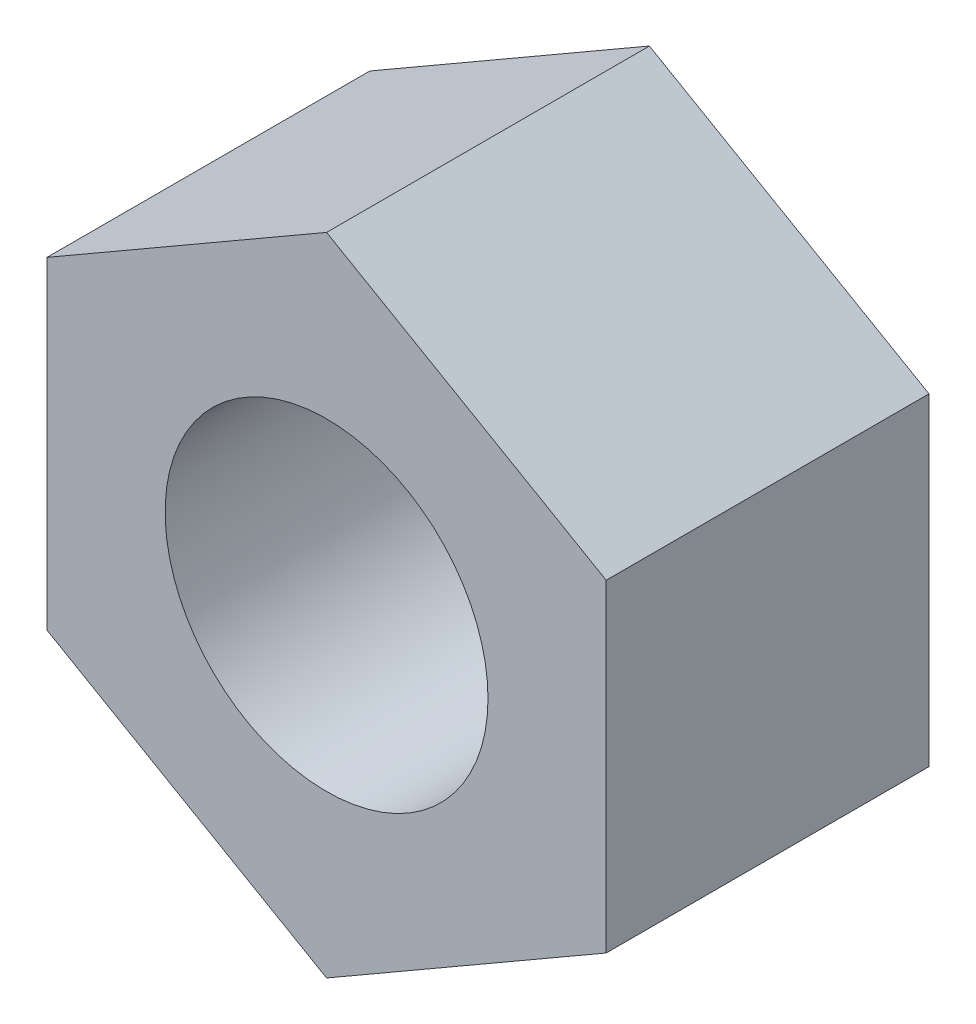
ISO-10303-21;
HEADER;
FILE_DESCRIPTION(('STEP AP214'),'2;1');
FILE_NAME('part.step','',(''),(''),'','','');
FILE_SCHEMA(('AUTOMOTIVE_DESIGN { 1 0 10303 214 1 1 1 1 }'));
ENDSEC;
DATA;
#1=APPLICATION_CONTEXT('core data for automotive mechanical design processes');
#2=APPLICATION_PROTOCOL_DEFINITION('international standard','automotive_design',2000,#1);
#3=PRODUCT_CONTEXT('',#1,'mechanical');
#4=PRODUCT('Part','Part','',(#3));
#5=PRODUCT_RELATED_PRODUCT_CATEGORY('part','',(#4));
#6=PRODUCT_DEFINITION_FORMATION('','',#4);
#7=PRODUCT_DEFINITION_CONTEXT('part definition',#1,'design');
#8=PRODUCT_DEFINITION('design','',#6,#7);
#9=PRODUCT_DEFINITION_SHAPE('','',#8);
#10=(LENGTH_UNIT() NAMED_UNIT(*) SI_UNIT(.MILLI.,.METRE.));
#11=(NAMED_UNIT(*) PLANE_ANGLE_UNIT() SI_UNIT($,.RADIAN.));
#12=(NAMED_UNIT(*) SI_UNIT($,.STERADIAN.) SOLID_ANGLE_UNIT());
#13=UNCERTAINTY_MEASURE_WITH_UNIT(LENGTH_MEASURE(1.E-05),#10,'distance_accuracy_value','');
#14=(GEOMETRIC_REPRESENTATION_CONTEXT(3) GLOBAL_UNCERTAINTY_ASSIGNED_CONTEXT((#13)) GLOBAL_UNIT_ASSIGNED_CONTEXT((#10,
#11,#12)) REPRESENTATION_CONTEXT('',''));
#15=CARTESIAN_POINT('',(0.,0.,0.));
#16=DIRECTION('',(0.,0.,1.));
#17=DIRECTION('',(1.,0.,0.));
#18=AXIS2_PLACEMENT_3D('',#15,#16,#17);
#19=CARTESIAN_POINT('',(0.,0.,10.));
#20=DIRECTION('',(0.,0.,1.));
#21=DIRECTION('',(1.,0.,0.));
#22=AXIS2_PLACEMENT_3D('',#19,#20,#21);
#23=PLANE('',#22);
#24=DIRECTION('',(0.,1.,0.));
#25=VECTOR('',#24,1.);
#26=CARTESIAN_POINT('',(8.66025403784439,-5.,10.));
#27=LINE('',#26,#25);
#28=CARTESIAN_POINT('',(8.66025403784439,-5.,10.));
#29=VERTEX_POINT('',#28);
#30=CARTESIAN_POINT('',(8.66025403784439,5.,10.));
#31=VERTEX_POINT('',#30);
#32=EDGE_CURVE('E135',#29,#31,#27,.T.);
#33=ORIENTED_EDGE('',*,*,#32,.T.);
#34=DIRECTION('',(-0.866025403784439,0.5,0.));
#35=VECTOR('',#34,1.);
#36=CARTESIAN_POINT('',(8.66025403784439,5.,10.));
#37=LINE('',#36,#35);
#38=CARTESIAN_POINT('',(0.,9.99999999999999,10.));
#39=VERTEX_POINT('',#38);
#40=EDGE_CURVE('E93',#31,#39,#37,.T.);
#41=ORIENTED_EDGE('',*,*,#40,.T.);
#42=DIRECTION('',(-0.866025403784439,-0.5,0.));
#43=VECTOR('',#42,1.);
#44=CARTESIAN_POINT('',(0.,9.99999999999999,10.));
#45=LINE('',#44,#43);
#46=CARTESIAN_POINT('',(-8.66025403784438,5.,10.));
#47=VERTEX_POINT('',#46);
#48=EDGE_CURVE('E106',#39,#47,#45,.T.);
#49=ORIENTED_EDGE('',*,*,#48,.T.);
#50=DIRECTION('',(0.,-1.,0.));
#51=VECTOR('',#50,1.);
#52=CARTESIAN_POINT('',(-8.66025403784438,5.,10.));
#53=LINE('',#52,#51);
#54=CARTESIAN_POINT('',(-8.66025403784438,-5.,10.));
#55=VERTEX_POINT('',#54);
#56=EDGE_CURVE('E100',#47,#55,#53,.T.);
#57=ORIENTED_EDGE('',*,*,#56,.T.);
#58=DIRECTION('',(0.866025403784438,-0.5,0.));
#59=VECTOR('',#58,1.);
#60=CARTESIAN_POINT('',(-8.66025403784438,-5.,10.));
#61=LINE('',#60,#59);
#62=CARTESIAN_POINT('',(0.,-10.,10.));
#63=VERTEX_POINT('',#62);
#64=EDGE_CURVE('E104',#55,#63,#61,.T.);
#65=ORIENTED_EDGE('',*,*,#64,.T.);
#66=DIRECTION('',(0.866025403784439,0.5,0.));
#67=VECTOR('',#66,1.);
#68=CARTESIAN_POINT('',(0.,-10.,10.));
#69=LINE('',#68,#67);
#70=EDGE_CURVE('E56',#63,#29,#69,.T.);
#71=ORIENTED_EDGE('',*,*,#70,.T.);
#72=EDGE_LOOP('',(#33,#41,#49,#57,#65,#71));
#73=FACE_BOUND('',#72,.T.);
#74=CARTESIAN_POINT('',(0.,0.,10.));
#75=DIRECTION('',(0.,0.,1.));
#76=DIRECTION('',(1.,0.,0.));
#77=AXIS2_PLACEMENT_3D('',#74,#75,#76);
#78=CIRCLE('',#77,5.);
#79=CARTESIAN_POINT('',(5.,0.,10.));
#80=VERTEX_POINT('',#79);
#81=EDGE_CURVE('E128',#80,#80,#78,.T.);
#82=ORIENTED_EDGE('',*,*,#81,.F.);
#83=EDGE_LOOP('',(#82));
#84=FACE_BOUND('',#83,.T.);
#85=ADVANCED_FACE('F39',(#73,#84),#23,.T.);
#86=CARTESIAN_POINT('',(0.,0.,0.));
#87=DIRECTION('',(0.,0.,1.));
#88=DIRECTION('',(1.,0.,0.));
#89=AXIS2_PLACEMENT_3D('',#86,#87,#88);
#90=PLANE('',#89);
#91=DIRECTION('',(0.,1.,0.));
#92=VECTOR('',#91,1.);
#93=CARTESIAN_POINT('',(8.66025403784439,-5.,0.));
#94=LINE('',#93,#92);
#95=CARTESIAN_POINT('',(8.66025403784439,-5.,0.));
#96=VERTEX_POINT('',#95);
#97=CARTESIAN_POINT('',(8.66025403784439,5.,0.));
#98=VERTEX_POINT('',#97);
#99=EDGE_CURVE('E124',#96,#98,#94,.T.);
#100=ORIENTED_EDGE('',*,*,#99,.F.);
#101=DIRECTION('',(0.866025403784439,0.5,0.));
#102=VECTOR('',#101,1.);
#103=CARTESIAN_POINT('',(0.,-10.,0.));
#104=LINE('',#103,#102);
#105=CARTESIAN_POINT('',(0.,-10.,0.));
#106=VERTEX_POINT('',#105);
#107=EDGE_CURVE('E85',#106,#96,#104,.T.);
#108=ORIENTED_EDGE('',*,*,#107,.F.);
#109=DIRECTION('',(0.866025403784438,-0.5,0.));
#110=VECTOR('',#109,1.);
#111=CARTESIAN_POINT('',(-8.66025403784438,-5.,0.));
#112=LINE('',#111,#110);
#113=CARTESIAN_POINT('',(-8.66025403784438,-5.,0.));
#114=VERTEX_POINT('',#113);
#115=EDGE_CURVE('E79',#114,#106,#112,.T.);
#116=ORIENTED_EDGE('',*,*,#115,.F.);
#117=DIRECTION('',(0.,-1.,0.));
#118=VECTOR('',#117,1.);
#119=CARTESIAN_POINT('',(-8.66025403784438,5.,0.));
#120=LINE('',#119,#118);
#121=CARTESIAN_POINT('',(-8.66025403784438,5.,0.));
#122=VERTEX_POINT('',#121);
#123=EDGE_CURVE('E114',#122,#114,#120,.T.);
#124=ORIENTED_EDGE('',*,*,#123,.F.);
#125=DIRECTION('',(-0.866025403784439,-0.5,0.));
#126=VECTOR('',#125,1.);
#127=CARTESIAN_POINT('',(0.,9.99999999999999,0.));
#128=LINE('',#127,#126);
#129=CARTESIAN_POINT('',(0.,9.99999999999999,0.));
#130=VERTEX_POINT('',#129);
#131=EDGE_CURVE('E130',#130,#122,#128,.T.);
#132=ORIENTED_EDGE('',*,*,#131,.F.);
#133=DIRECTION('',(-0.866025403784439,0.5,0.));
#134=VECTOR('',#133,1.);
#135=CARTESIAN_POINT('',(8.66025403784439,5.,0.));
#136=LINE('',#135,#134);
#137=EDGE_CURVE('E127',#98,#130,#136,.T.);
#138=ORIENTED_EDGE('',*,*,#137,.F.);
#139=EDGE_LOOP('',(#100,#108,#116,#124,#132,#138));
#140=FACE_BOUND('',#139,.T.);
#141=CARTESIAN_POINT('',(0.,0.,0.));
#142=DIRECTION('',(0.,0.,1.));
#143=DIRECTION('',(1.,0.,0.));
#144=AXIS2_PLACEMENT_3D('',#141,#142,#143);
#145=CIRCLE('',#144,5.);
#146=CARTESIAN_POINT('',(5.,0.,0.));
#147=VERTEX_POINT('',#146);
#148=EDGE_CURVE('E228',#147,#147,#145,.T.);
#149=ORIENTED_EDGE('',*,*,#148,.T.);
#150=EDGE_LOOP('',(#149));
#151=FACE_BOUND('',#150,.T.);
#152=ADVANCED_FACE('F144',(#140,#151),#90,.F.);
#153=CARTESIAN_POINT('',(8.66025403784439,-5.,10.));
#154=DIRECTION('',(-1.,0.,0.));
#155=DIRECTION('',(0.,0.,1.));
#156=AXIS2_PLACEMENT_3D('',#153,#154,#155);
#157=PLANE('',#156);
#158=ORIENTED_EDGE('',*,*,#99,.T.);
#159=DIRECTION('',(0.,0.,-1.));
#160=VECTOR('',#159,1.);
#161=CARTESIAN_POINT('',(8.66025403784439,5.,10.));
#162=LINE('',#161,#160);
#163=EDGE_CURVE('E11',#31,#98,#162,.T.);
#164=ORIENTED_EDGE('',*,*,#163,.F.);
#165=ORIENTED_EDGE('',*,*,#32,.F.);
#166=DIRECTION('',(0.,0.,-1.));
#167=VECTOR('',#166,1.);
#168=CARTESIAN_POINT('',(8.66025403784439,-5.,10.));
#169=LINE('',#168,#167);
#170=EDGE_CURVE('E120',#29,#96,#169,.T.);
#171=ORIENTED_EDGE('',*,*,#170,.T.);
#172=EDGE_LOOP('',(#158,#164,#165,#171));
#173=FACE_BOUND('',#172,.T.);
#174=ADVANCED_FACE('F41',(#173),#157,.F.);
#175=CARTESIAN_POINT('',(8.66025403784439,5.,10.));
#176=DIRECTION('',(-0.5,-0.866025403784439,0.));
#177=DIRECTION('',(0.866025403784439,-0.5,0.));
#178=AXIS2_PLACEMENT_3D('',#175,#176,#177);
#179=PLANE('',#178);
#180=ORIENTED_EDGE('',*,*,#137,.T.);
#181=DIRECTION('',(0.,0.,-1.));
#182=VECTOR('',#181,1.);
#183=CARTESIAN_POINT('',(0.,9.99999999999999,10.));
#184=LINE('',#183,#182);
#185=EDGE_CURVE('E48',#39,#130,#184,.T.);
#186=ORIENTED_EDGE('',*,*,#185,.F.);
#187=ORIENTED_EDGE('',*,*,#40,.F.);
#188=ORIENTED_EDGE('',*,*,#163,.T.);
#189=EDGE_LOOP('',(#180,#186,#187,#188));
#190=FACE_BOUND('',#189,.T.);
#191=ADVANCED_FACE('F169',(#190),#179,.F.);
#192=CARTESIAN_POINT('',(0.,9.99999999999999,10.));
#193=DIRECTION('',(0.5,-0.866025403784439,0.));
#194=DIRECTION('',(0.866025403784439,0.5,0.));
#195=AXIS2_PLACEMENT_3D('',#192,#193,#194);
#196=PLANE('',#195);
#197=ORIENTED_EDGE('',*,*,#131,.T.);
#198=DIRECTION('',(0.,0.,-1.));
#199=VECTOR('',#198,1.);
#200=CARTESIAN_POINT('',(-8.66025403784438,5.,10.));
#201=LINE('',#200,#199);
#202=EDGE_CURVE('E115',#47,#122,#201,.T.);
#203=ORIENTED_EDGE('',*,*,#202,.F.);
#204=ORIENTED_EDGE('',*,*,#48,.F.);
#205=ORIENTED_EDGE('',*,*,#185,.T.);
#206=EDGE_LOOP('',(#197,#203,#204,#205));
#207=FACE_BOUND('',#206,.T.);
#208=ADVANCED_FACE('F141',(#207),#196,.F.);
#209=CARTESIAN_POINT('',(-8.66025403784438,5.,10.));
#210=DIRECTION('',(1.,0.,0.));
#211=DIRECTION('',(0.,0.,-1.));
#212=AXIS2_PLACEMENT_3D('',#209,#210,#211);
#213=PLANE('',#212);
#214=ORIENTED_EDGE('',*,*,#123,.T.);
#215=DIRECTION('',(0.,0.,-1.));
#216=VECTOR('',#215,1.);
#217=CARTESIAN_POINT('',(-8.66025403784438,-5.,10.));
#218=LINE('',#217,#216);
#219=EDGE_CURVE('E111',#55,#114,#218,.T.);
#220=ORIENTED_EDGE('',*,*,#219,.F.);
#221=ORIENTED_EDGE('',*,*,#56,.F.);
#222=ORIENTED_EDGE('',*,*,#202,.T.);
#223=EDGE_LOOP('',(#214,#220,#221,#222));
#224=FACE_BOUND('',#223,.T.);
#225=ADVANCED_FACE('F112',(#224),#213,.F.);
#226=CARTESIAN_POINT('',(-8.66025403784438,-5.,10.));
#227=DIRECTION('',(0.5,0.866025403784438,0.));
#228=DIRECTION('',(-0.866025403784439,0.5,0.));
#229=AXIS2_PLACEMENT_3D('',#226,#227,#228);
#230=PLANE('',#229);
#231=ORIENTED_EDGE('',*,*,#115,.T.);
#232=DIRECTION('',(0.,0.,-1.));
#233=VECTOR('',#232,1.);
#234=CARTESIAN_POINT('',(0.,-10.,10.));
#235=LINE('',#234,#233);
#236=EDGE_CURVE('E116',#63,#106,#235,.T.);
#237=ORIENTED_EDGE('',*,*,#236,.F.);
#238=ORIENTED_EDGE('',*,*,#64,.F.);
#239=ORIENTED_EDGE('',*,*,#219,.T.);
#240=EDGE_LOOP('',(#231,#237,#238,#239));
#241=FACE_BOUND('',#240,.T.);
#242=ADVANCED_FACE('F118',(#241),#230,.F.);
#243=CARTESIAN_POINT('',(0.,-10.,10.));
#244=DIRECTION('',(-0.5,0.866025403784439,0.));
#245=DIRECTION('',(-0.866025403784439,-0.5,0.));
#246=AXIS2_PLACEMENT_3D('',#243,#244,#245);
#247=PLANE('',#246);
#248=ORIENTED_EDGE('',*,*,#107,.T.);
#249=ORIENTED_EDGE('',*,*,#170,.F.);
#250=ORIENTED_EDGE('',*,*,#70,.F.);
#251=ORIENTED_EDGE('',*,*,#236,.T.);
#252=EDGE_LOOP('',(#248,#249,#250,#251));
#253=FACE_BOUND('',#252,.T.);
#254=ADVANCED_FACE('F149',(#253),#247,.F.);
#255=CARTESIAN_POINT('',(0.,0.,10.));
#256=DIRECTION('',(0.,0.,-1.));
#257=DIRECTION('',(-1.,0.,0.));
#258=AXIS2_PLACEMENT_3D('',#255,#256,#257);
#259=CYLINDRICAL_SURFACE('',#258,5.);
#260=ORIENTED_EDGE('',*,*,#81,.T.);
#261=EDGE_LOOP('',(#260));
#262=FACE_BOUND('',#261,.T.);
#263=ORIENTED_EDGE('',*,*,#148,.F.);
#264=EDGE_LOOP('',(#263));
#265=FACE_BOUND('',#264,.T.);
#266=ADVANCED_FACE('F151',(#262,#265),#259,.F.);
#267=CLOSED_SHELL('',(#85,#152,#174,#191,#208,#225,#242,#254,#266));
#268=MANIFOLD_SOLID_BREP('B2',#267);
#269=ADVANCED_BREP_SHAPE_REPRESENTATION('',(#18,#268),#14);
#270=SHAPE_DEFINITION_REPRESENTATION(#9,#269);
ENDSEC;
END-ISO-10303-21;
